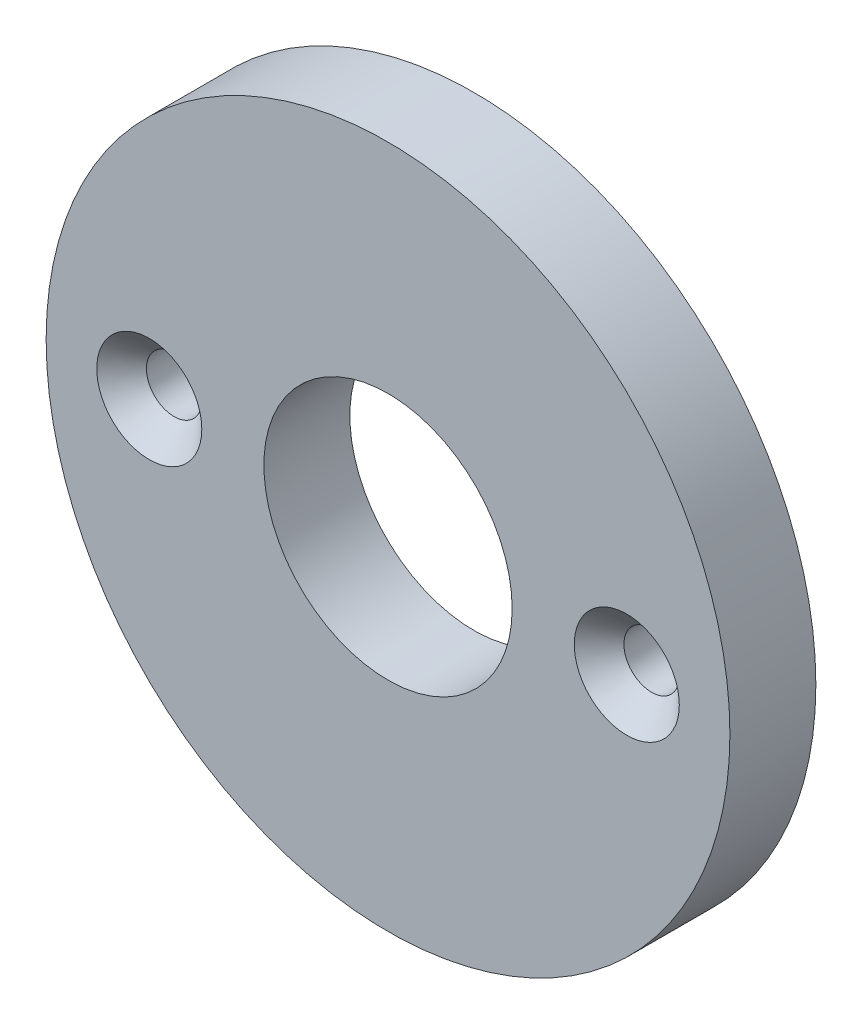
ISO-10303-21;
HEADER;
FILE_DESCRIPTION(('STEP AP214'),'2;1');
FILE_NAME('part.step','',(''),(''),'','','');
FILE_SCHEMA(('AUTOMOTIVE_DESIGN { 1 0 10303 214 1 1 1 1 }'));
ENDSEC;
DATA;
#1=APPLICATION_CONTEXT('core data for automotive mechanical design processes');
#2=APPLICATION_PROTOCOL_DEFINITION('international standard','automotive_design',2000,#1);
#3=PRODUCT_CONTEXT('',#1,'mechanical');
#4=PRODUCT('Part','Part','',(#3));
#5=PRODUCT_RELATED_PRODUCT_CATEGORY('part','',(#4));
#6=PRODUCT_DEFINITION_FORMATION('','',#4);
#7=PRODUCT_DEFINITION_CONTEXT('part definition',#1,'design');
#8=PRODUCT_DEFINITION('design','',#6,#7);
#9=PRODUCT_DEFINITION_SHAPE('','',#8);
#10=(LENGTH_UNIT() NAMED_UNIT(*) SI_UNIT(.MILLI.,.METRE.));
#11=(NAMED_UNIT(*) PLANE_ANGLE_UNIT() SI_UNIT($,.RADIAN.));
#12=(NAMED_UNIT(*) SI_UNIT($,.STERADIAN.) SOLID_ANGLE_UNIT());
#13=UNCERTAINTY_MEASURE_WITH_UNIT(LENGTH_MEASURE(1.E-05),#10,'distance_accuracy_value','');
#14=(GEOMETRIC_REPRESENTATION_CONTEXT(3) GLOBAL_UNCERTAINTY_ASSIGNED_CONTEXT((#13)) GLOBAL_UNIT_ASSIGNED_CONTEXT((#10,
#11,#12)) REPRESENTATION_CONTEXT('',''));
#15=CARTESIAN_POINT('',(0.,0.,0.));
#16=DIRECTION('',(0.,0.,1.));
#17=DIRECTION('',(1.,0.,0.));
#18=AXIS2_PLACEMENT_3D('',#15,#16,#17);
#19=CARTESIAN_POINT('',(0.,0.,0.));
#20=DIRECTION('',(0.,0.,1.));
#21=DIRECTION('',(1.,0.,0.));
#22=AXIS2_PLACEMENT_3D('',#19,#20,#21);
#23=PLANE('',#22);
#24=CARTESIAN_POINT('',(-12.5,0.,0.));
#25=DIRECTION('',(0.,0.,1.));
#26=DIRECTION('',(1.,0.,0.));
#27=AXIS2_PLACEMENT_3D('',#24,#25,#26);
#28=CIRCLE('',#27,1.44999999999999);
#29=CARTESIAN_POINT('',(-11.05,0.,0.));
#30=VERTEX_POINT('',#29);
#31=EDGE_CURVE('E60',#30,#30,#28,.F.);
#32=ORIENTED_EDGE('',*,*,#31,.F.);
#33=EDGE_LOOP('',(#32));
#34=FACE_BOUND('',#33,.T.);
#35=CARTESIAN_POINT('',(0.,0.,0.));
#36=DIRECTION('',(0.,0.,1.));
#37=DIRECTION('',(1.,0.,0.));
#38=AXIS2_PLACEMENT_3D('',#35,#36,#37);
#39=CIRCLE('',#38,17.9);
#40=CARTESIAN_POINT('',(17.9,0.,0.));
#41=VERTEX_POINT('',#40);
#42=EDGE_CURVE('E39',#41,#41,#39,.T.);
#43=ORIENTED_EDGE('',*,*,#42,.F.);
#44=EDGE_LOOP('',(#43));
#45=FACE_BOUND('',#44,.T.);
#46=CARTESIAN_POINT('',(0.,0.,0.));
#47=DIRECTION('',(0.,0.,1.));
#48=DIRECTION('',(1.,0.,0.));
#49=AXIS2_PLACEMENT_3D('',#46,#47,#48);
#50=CIRCLE('',#49,6.5);
#51=CARTESIAN_POINT('',(6.5,0.,0.));
#52=VERTEX_POINT('',#51);
#53=EDGE_CURVE('E48',#52,#52,#50,.T.);
#54=ORIENTED_EDGE('',*,*,#53,.T.);
#55=EDGE_LOOP('',(#54));
#56=FACE_BOUND('',#55,.T.);
#57=CARTESIAN_POINT('',(12.5,0.,0.));
#58=DIRECTION('',(0.,0.,1.));
#59=DIRECTION('',(1.,0.,0.));
#60=AXIS2_PLACEMENT_3D('',#57,#58,#59);
#61=CIRCLE('',#60,1.44999999999999);
#62=CARTESIAN_POINT('',(13.95,0.,0.));
#63=VERTEX_POINT('',#62);
#64=EDGE_CURVE('E51',#63,#63,#61,.F.);
#65=ORIENTED_EDGE('',*,*,#64,.F.);
#66=EDGE_LOOP('',(#65));
#67=FACE_BOUND('',#66,.T.);
#68=ADVANCED_FACE('F35',(#34,#45,#56,#67),#23,.F.);
#69=CARTESIAN_POINT('',(0.,0.,4.5));
#70=DIRECTION('',(0.,0.,1.));
#71=DIRECTION('',(1.,0.,0.));
#72=AXIS2_PLACEMENT_3D('',#69,#70,#71);
#73=PLANE('',#72);
#74=CARTESIAN_POINT('',(-12.5,0.,4.5));
#75=DIRECTION('',(0.,0.,1.));
#76=DIRECTION('',(1.,0.,0.));
#77=AXIS2_PLACEMENT_3D('',#74,#75,#76);
#78=CIRCLE('',#77,2.75);
#79=CARTESIAN_POINT('',(-9.75,0.,4.5));
#80=VERTEX_POINT('',#79);
#81=EDGE_CURVE('E66',#80,#80,#78,.T.);
#82=ORIENTED_EDGE('',*,*,#81,.F.);
#83=EDGE_LOOP('',(#82));
#84=FACE_BOUND('',#83,.T.);
#85=CARTESIAN_POINT('',(12.5,0.,4.5));
#86=DIRECTION('',(0.,0.,1.));
#87=DIRECTION('',(1.,0.,0.));
#88=AXIS2_PLACEMENT_3D('',#85,#86,#87);
#89=CIRCLE('',#88,2.75);
#90=CARTESIAN_POINT('',(15.25,0.,4.5));
#91=VERTEX_POINT('',#90);
#92=EDGE_CURVE('E57',#91,#91,#89,.T.);
#93=ORIENTED_EDGE('',*,*,#92,.F.);
#94=EDGE_LOOP('',(#93));
#95=FACE_BOUND('',#94,.T.);
#96=CARTESIAN_POINT('',(0.,0.,4.5));
#97=DIRECTION('',(0.,0.,1.));
#98=DIRECTION('',(1.,0.,0.));
#99=AXIS2_PLACEMENT_3D('',#96,#97,#98);
#100=CIRCLE('',#99,17.9);
#101=CARTESIAN_POINT('',(17.9,0.,4.5));
#102=VERTEX_POINT('',#101);
#103=EDGE_CURVE('E10',#102,#102,#100,.T.);
#104=ORIENTED_EDGE('',*,*,#103,.T.);
#105=EDGE_LOOP('',(#104));
#106=FACE_BOUND('',#105,.T.);
#107=CARTESIAN_POINT('',(0.,0.,4.5));
#108=DIRECTION('',(0.,0.,1.));
#109=DIRECTION('',(1.,0.,0.));
#110=AXIS2_PLACEMENT_3D('',#107,#108,#109);
#111=CIRCLE('',#110,6.5);
#112=CARTESIAN_POINT('',(6.5,0.,4.5));
#113=VERTEX_POINT('',#112);
#114=EDGE_CURVE('E46',#113,#113,#111,.T.);
#115=ORIENTED_EDGE('',*,*,#114,.F.);
#116=EDGE_LOOP('',(#115));
#117=FACE_BOUND('',#116,.T.);
#118=ADVANCED_FACE('F77',(#84,#95,#106,#117),#73,.T.);
#119=CARTESIAN_POINT('',(0.,0.,4.5));
#120=DIRECTION('',(0.,0.,-1.));
#121=DIRECTION('',(-1.,0.,0.));
#122=AXIS2_PLACEMENT_3D('',#119,#120,#121);
#123=CYLINDRICAL_SURFACE('',#122,17.9);
#124=ORIENTED_EDGE('',*,*,#103,.F.);
#125=EDGE_LOOP('',(#124));
#126=FACE_BOUND('',#125,.T.);
#127=ORIENTED_EDGE('',*,*,#42,.T.);
#128=EDGE_LOOP('',(#127));
#129=FACE_BOUND('',#128,.T.);
#130=ADVANCED_FACE('F37',(#126,#129),#123,.T.);
#131=CARTESIAN_POINT('',(0.,0.,4.5));
#132=DIRECTION('',(0.,0.,-1.));
#133=DIRECTION('',(-1.,0.,0.));
#134=AXIS2_PLACEMENT_3D('',#131,#132,#133);
#135=CYLINDRICAL_SURFACE('',#134,6.5);
#136=ORIENTED_EDGE('',*,*,#114,.T.);
#137=EDGE_LOOP('',(#136));
#138=FACE_BOUND('',#137,.T.);
#139=ORIENTED_EDGE('',*,*,#53,.F.);
#140=EDGE_LOOP('',(#139));
#141=FACE_BOUND('',#140,.T.);
#142=ADVANCED_FACE('F88',(#138,#141),#135,.F.);
#143=CARTESIAN_POINT('',(12.5,0.,4.5));
#144=DIRECTION('',(0.,0.,1.));
#145=DIRECTION('',(1.,0.,0.));
#146=AXIS2_PLACEMENT_3D('',#143,#144,#145);
#147=CYLINDRICAL_SURFACE('',#146,1.44999999999999);
#148=ORIENTED_EDGE('',*,*,#64,.T.);
#149=EDGE_LOOP('',(#148));
#150=FACE_BOUND('',#149,.T.);
#151=CARTESIAN_POINT('',(12.5,0.,3.19999999999999));
#152=DIRECTION('',(0.,0.,1.));
#153=DIRECTION('',(1.,0.,0.));
#154=AXIS2_PLACEMENT_3D('',#151,#152,#153);
#155=CIRCLE('',#154,1.44999999999999);
#156=CARTESIAN_POINT('',(13.95,0.,3.19999999999999));
#157=VERTEX_POINT('',#156);
#158=EDGE_CURVE('E54',#157,#157,#155,.T.);
#159=ORIENTED_EDGE('',*,*,#158,.T.);
#160=EDGE_LOOP('',(#159));
#161=FACE_BOUND('',#160,.T.);
#162=ADVANCED_FACE('F84',(#150,#161),#147,.F.);
#163=CARTESIAN_POINT('',(12.5,0.,4.5));
#164=DIRECTION('',(0.,0.,1.));
#165=DIRECTION('',(1.,0.,0.));
#166=AXIS2_PLACEMENT_3D('',#163,#164,#165);
#167=CONICAL_SURFACE('',#166,2.75,0.785398163397448);
#168=ORIENTED_EDGE('',*,*,#158,.F.);
#169=EDGE_LOOP('',(#168));
#170=FACE_BOUND('',#169,.T.);
#171=ORIENTED_EDGE('',*,*,#92,.T.);
#172=EDGE_LOOP('',(#171));
#173=FACE_BOUND('',#172,.T.);
#174=ADVANCED_FACE('F87',(#170,#173),#167,.F.);
#175=CARTESIAN_POINT('',(-12.5,0.,4.5));
#176=DIRECTION('',(0.,0.,1.));
#177=DIRECTION('',(1.,0.,0.));
#178=AXIS2_PLACEMENT_3D('',#175,#176,#177);
#179=CYLINDRICAL_SURFACE('',#178,1.44999999999999);
#180=ORIENTED_EDGE('',*,*,#31,.T.);
#181=EDGE_LOOP('',(#180));
#182=FACE_BOUND('',#181,.T.);
#183=CARTESIAN_POINT('',(-12.5,0.,3.19999999999999));
#184=DIRECTION('',(0.,0.,1.));
#185=DIRECTION('',(1.,0.,0.));
#186=AXIS2_PLACEMENT_3D('',#183,#184,#185);
#187=CIRCLE('',#186,1.44999999999999);
#188=CARTESIAN_POINT('',(-11.05,0.,3.19999999999999));
#189=VERTEX_POINT('',#188);
#190=EDGE_CURVE('E63',#189,#189,#187,.T.);
#191=ORIENTED_EDGE('',*,*,#190,.T.);
#192=EDGE_LOOP('',(#191));
#193=FACE_BOUND('',#192,.T.);
#194=ADVANCED_FACE('F72',(#182,#193),#179,.F.);
#195=CARTESIAN_POINT('',(-12.5,0.,4.5));
#196=DIRECTION('',(0.,0.,1.));
#197=DIRECTION('',(1.,0.,0.));
#198=AXIS2_PLACEMENT_3D('',#195,#196,#197);
#199=CONICAL_SURFACE('',#198,2.75,0.785398163397448);
#200=ORIENTED_EDGE('',*,*,#190,.F.);
#201=EDGE_LOOP('',(#200));
#202=FACE_BOUND('',#201,.T.);
#203=ORIENTED_EDGE('',*,*,#81,.T.);
#204=EDGE_LOOP('',(#203));
#205=FACE_BOUND('',#204,.T.);
#206=ADVANCED_FACE('F113',(#202,#205),#199,.F.);
#207=CLOSED_SHELL('',(#68,#118,#130,#142,#162,#174,#194,#206));
#208=MANIFOLD_SOLID_BREP('B2',#207);
#209=ADVANCED_BREP_SHAPE_REPRESENTATION('',(#18,#208),#14);
#210=SHAPE_DEFINITION_REPRESENTATION(#9,#209);
ENDSEC;
END-ISO-10303-21;
